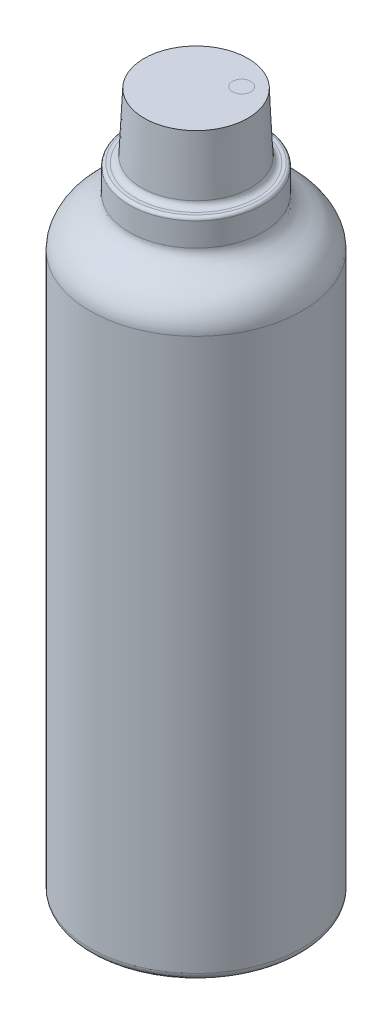
ISO-10303-21;
HEADER;
FILE_DESCRIPTION(('STEP AP214'),'2;1');
FILE_NAME('part.step','',(''),(''),'','','');
FILE_SCHEMA(('AUTOMOTIVE_DESIGN { 1 0 10303 214 1 1 1 1 }'));
ENDSEC;
DATA;
#1=APPLICATION_CONTEXT('core data for automotive mechanical design processes');
#2=APPLICATION_PROTOCOL_DEFINITION('international standard','automotive_design',2000,#1);
#3=PRODUCT_CONTEXT('',#1,'mechanical');
#4=PRODUCT('Part','Part','',(#3));
#5=PRODUCT_RELATED_PRODUCT_CATEGORY('part','',(#4));
#6=PRODUCT_DEFINITION_FORMATION('','',#4);
#7=PRODUCT_DEFINITION_CONTEXT('part definition',#1,'design');
#8=PRODUCT_DEFINITION('design','',#6,#7);
#9=PRODUCT_DEFINITION_SHAPE('','',#8);
#10=(LENGTH_UNIT() NAMED_UNIT(*) SI_UNIT(.MILLI.,.METRE.));
#11=(NAMED_UNIT(*) PLANE_ANGLE_UNIT() SI_UNIT($,.RADIAN.));
#12=(NAMED_UNIT(*) SI_UNIT($,.STERADIAN.) SOLID_ANGLE_UNIT());
#13=UNCERTAINTY_MEASURE_WITH_UNIT(LENGTH_MEASURE(1.E-05),#10,'distance_accuracy_value','');
#14=(GEOMETRIC_REPRESENTATION_CONTEXT(3) GLOBAL_UNCERTAINTY_ASSIGNED_CONTEXT((#13)) GLOBAL_UNIT_ASSIGNED_CONTEXT((#10,
#11,#12)) REPRESENTATION_CONTEXT('',''));
#15=CARTESIAN_POINT('',(0.,0.,0.));
#16=DIRECTION('',(0.,0.,1.));
#17=DIRECTION('',(1.,0.,0.));
#18=AXIS2_PLACEMENT_3D('',#15,#16,#17);
#19=CARTESIAN_POINT('',(0.,230.,0.));
#20=DIRECTION('',(0.,1.,0.));
#21=DIRECTION('',(0.,0.,1.));
#22=AXIS2_PLACEMENT_3D('',#19,#20,#21);
#23=PLANE('',#22);
#24=CARTESIAN_POINT('',(0.,230.,0.));
#25=DIRECTION('',(0.,-1.,0.));
#26=DIRECTION('',(0.,0.,-1.));
#27=AXIS2_PLACEMENT_3D('',#24,#25,#26);
#28=CIRCLE('',#27,17.06);
#29=CARTESIAN_POINT('',(0.,230.,-17.06));
#30=VERTEX_POINT('',#29);
#31=EDGE_CURVE('E78',#30,#30,#28,.T.);
#32=ORIENTED_EDGE('',*,*,#31,.F.);
#33=EDGE_LOOP('',(#32));
#34=FACE_BOUND('',#33,.T.);
#35=CARTESIAN_POINT('',(7.,230.,-8.));
#36=DIRECTION('',(0.,1.,0.));
#37=DIRECTION('',(0.,0.,1.));
#38=AXIS2_PLACEMENT_3D('',#35,#36,#37);
#39=CIRCLE('',#38,3.);
#40=CARTESIAN_POINT('',(7.,230.,-5.));
#41=VERTEX_POINT('',#40);
#42=EDGE_CURVE('E10',#41,#41,#39,.F.);
#43=ORIENTED_EDGE('',*,*,#42,.T.);
#44=EDGE_LOOP('',(#43));
#45=FACE_BOUND('',#44,.T.);
#46=ADVANCED_FACE('F37',(#34,#45),#23,.T.);
#47=CARTESIAN_POINT('',(0.,207.75,0.));
#48=DIRECTION('',(0.,-1.,0.));
#49=DIRECTION('',(0.,0.,-1.));
#50=AXIS2_PLACEMENT_3D('',#47,#48,#49);
#51=TOROIDAL_SURFACE('',#50,21.,1.);
#52=CARTESIAN_POINT('',(0.,208.75,0.));
#53=DIRECTION('',(0.,-1.,0.));
#54=DIRECTION('',(0.,0.,-1.));
#55=AXIS2_PLACEMENT_3D('',#52,#53,#54);
#56=CIRCLE('',#55,21.);
#57=CARTESIAN_POINT('',(0.,208.75,-21.));
#58=VERTEX_POINT('',#57);
#59=EDGE_CURVE('E87',#58,#58,#56,.T.);
#60=ORIENTED_EDGE('',*,*,#59,.T.);
#61=EDGE_LOOP('',(#60));
#62=FACE_BOUND('',#61,.T.);
#63=CARTESIAN_POINT('',(0.,207.75,0.));
#64=DIRECTION('',(0.,-1.,0.));
#65=DIRECTION('',(0.,0.,-1.));
#66=AXIS2_PLACEMENT_3D('',#63,#64,#65);
#67=CIRCLE('',#66,22.);
#68=CARTESIAN_POINT('',(0.,207.75,-22.));
#69=VERTEX_POINT('',#68);
#70=EDGE_CURVE('E45',#69,#69,#67,.T.);
#71=ORIENTED_EDGE('',*,*,#70,.F.);
#72=EDGE_LOOP('',(#71));
#73=FACE_BOUND('',#72,.T.);
#74=ADVANCED_FACE('F39',(#62,#73),#51,.T.);
#75=CARTESIAN_POINT('',(0.,0.,0.));
#76=DIRECTION('',(0.,-1.,0.));
#77=DIRECTION('',(0.,0.,-1.));
#78=AXIS2_PLACEMENT_3D('',#75,#76,#77);
#79=CYLINDRICAL_SURFACE('',#78,22.);
#80=ORIENTED_EDGE('',*,*,#70,.T.);
#81=EDGE_LOOP('',(#80));
#82=FACE_BOUND('',#81,.T.);
#83=CARTESIAN_POINT('',(0.,200.,0.));
#84=DIRECTION('',(0.,-1.,0.));
#85=DIRECTION('',(0.,0.,-1.));
#86=AXIS2_PLACEMENT_3D('',#83,#84,#85);
#87=CIRCLE('',#86,22.);
#88=CARTESIAN_POINT('',(0.,200.,-22.));
#89=VERTEX_POINT('',#88);
#90=EDGE_CURVE('E51',#89,#89,#87,.T.);
#91=ORIENTED_EDGE('',*,*,#90,.F.);
#92=EDGE_LOOP('',(#91));
#93=FACE_BOUND('',#92,.T.);
#94=ADVANCED_FACE('F101',(#82,#93),#79,.T.);
#95=CARTESIAN_POINT('',(34.9,184.,0.));
#96=CARTESIAN_POINT('',(34.9,186.989827139463,0.));
#97=CARTESIAN_POINT('',(31.9156301226645,192.216128506132,0.));
#98=CARTESIAN_POINT('',(25.8249064696677,195.02723074203,0.));
#99=CARTESIAN_POINT('',(22.,197.912231805774,0.));
#100=CARTESIAN_POINT('',(22.,200.,0.));
#101=B_SPLINE_CURVE_WITH_KNOTS('',3,(#95,#96,#97,#98,#99,#100),.UNSPECIFIED.,.F.,.F.,(4,1,1,4),
(0.,0.42378280186537,0.726128109276307,1.),.UNSPECIFIED.);
#102=CARTESIAN_POINT('',(0.,0.,0.));
#103=DIRECTION('',(0.,-1.,0.));
#104=AXIS1_PLACEMENT('',#102,#103);
#105=SURFACE_OF_REVOLUTION('',#101,#104);
#106=ORIENTED_EDGE('',*,*,#90,.T.);
#107=EDGE_LOOP('',(#106));
#108=FACE_BOUND('',#107,.T.);
#109=CARTESIAN_POINT('',(0.,184.,0.));
#110=DIRECTION('',(0.,-1.,0.));
#111=DIRECTION('',(0.,0.,-1.));
#112=AXIS2_PLACEMENT_3D('',#109,#110,#111);
#113=CIRCLE('',#112,34.9);
#114=CARTESIAN_POINT('',(0.,184.,-34.9));
#115=VERTEX_POINT('',#114);
#116=EDGE_CURVE('E55',#115,#115,#113,.T.);
#117=ORIENTED_EDGE('',*,*,#116,.F.);
#118=EDGE_LOOP('',(#117));
#119=FACE_BOUND('',#118,.T.);
#120=ADVANCED_FACE('F97',(#108,#119),#105,.F.);
#121=CARTESIAN_POINT('',(0.,0.,0.));
#122=DIRECTION('',(0.,-1.,0.));
#123=DIRECTION('',(0.,0.,-1.));
#124=AXIS2_PLACEMENT_3D('',#121,#122,#123);
#125=CYLINDRICAL_SURFACE('',#124,34.9);
#126=ORIENTED_EDGE('',*,*,#116,.T.);
#127=EDGE_LOOP('',(#126));
#128=FACE_BOUND('',#127,.T.);
#129=CARTESIAN_POINT('',(0.,2.5,0.));
#130=DIRECTION('',(0.,-1.,0.));
#131=DIRECTION('',(0.,0.,-1.));
#132=AXIS2_PLACEMENT_3D('',#129,#130,#131);
#133=CIRCLE('',#132,34.9);
#134=CARTESIAN_POINT('',(0.,2.5,-34.9));
#135=VERTEX_POINT('',#134);
#136=EDGE_CURVE('E60',#135,#135,#133,.T.);
#137=ORIENTED_EDGE('',*,*,#136,.F.);
#138=EDGE_LOOP('',(#137));
#139=FACE_BOUND('',#138,.T.);
#140=ADVANCED_FACE('F100',(#128,#139),#125,.T.);
#141=CARTESIAN_POINT('',(0.,2.5,0.));
#142=DIRECTION('',(0.,-1.,0.));
#143=DIRECTION('',(0.,0.,-1.));
#144=AXIS2_PLACEMENT_3D('',#141,#142,#143);
#145=TOROIDAL_SURFACE('',#144,32.4,2.5);
#146=ORIENTED_EDGE('',*,*,#136,.T.);
#147=EDGE_LOOP('',(#146));
#148=FACE_BOUND('',#147,.T.);
#149=CARTESIAN_POINT('',(0.,0.,0.));
#150=DIRECTION('',(0.,-1.,0.));
#151=DIRECTION('',(0.,0.,-1.));
#152=AXIS2_PLACEMENT_3D('',#149,#150,#151);
#153=CIRCLE('',#152,32.4);
#154=CARTESIAN_POINT('',(0.,0.,-32.4));
#155=VERTEX_POINT('',#154);
#156=EDGE_CURVE('E63',#155,#155,#153,.T.);
#157=ORIENTED_EDGE('',*,*,#156,.F.);
#158=EDGE_LOOP('',(#157));
#159=FACE_BOUND('',#158,.T.);
#160=ADVANCED_FACE('F143',(#148,#159),#145,.T.);
#161=CARTESIAN_POINT('',(28.17645836158,0.,0.));
#162=DIRECTION('',(0.,-1.,0.));
#163=DIRECTION('',(0.,0.,-1.));
#164=AXIS2_PLACEMENT_3D('',#161,#162,#163);
#165=PLANE('',#164);
#166=ORIENTED_EDGE('',*,*,#156,.T.);
#167=EDGE_LOOP('',(#166));
#168=FACE_BOUND('',#167,.T.);
#169=CARTESIAN_POINT('',(0.,0.,0.));
#170=DIRECTION('',(0.,-1.,0.));
#171=DIRECTION('',(0.,0.,-1.));
#172=AXIS2_PLACEMENT_3D('',#169,#170,#171);
#173=CIRCLE('',#172,28.17645836158);
#174=CARTESIAN_POINT('',(0.,0.,-28.17645836158));
#175=VERTEX_POINT('',#174);
#176=EDGE_CURVE('E66',#175,#175,#173,.T.);
#177=ORIENTED_EDGE('',*,*,#176,.F.);
#178=EDGE_LOOP('',(#177));
#179=FACE_BOUND('',#178,.T.);
#180=ADVANCED_FACE('F140',(#168,#179),#165,.T.);
#181=CARTESIAN_POINT('',(0.,3.,0.));
#182=DIRECTION('',(0.,-1.,0.));
#183=DIRECTION('',(0.,0.,-1.));
#184=AXIS2_PLACEMENT_3D('',#181,#182,#183);
#185=TOROIDAL_SURFACE('',#184,28.17645836158,3.);
#186=ORIENTED_EDGE('',*,*,#176,.T.);
#187=EDGE_LOOP('',(#186));
#188=FACE_BOUND('',#187,.T.);
#189=CARTESIAN_POINT('',(0.,0.180922137642276,0.));
#190=DIRECTION('',(0.,-1.,0.));
#191=DIRECTION('',(0.,0.,-1.));
#192=AXIS2_PLACEMENT_3D('',#189,#190,#191);
#193=CIRCLE('',#192,27.150397931603);
#194=CARTESIAN_POINT('',(0.,0.180922137642276,-27.150397931603));
#195=VERTEX_POINT('',#194);
#196=EDGE_CURVE('E69',#195,#195,#193,.T.);
#197=ORIENTED_EDGE('',*,*,#196,.F.);
#198=EDGE_LOOP('',(#197));
#199=FACE_BOUND('',#198,.T.);
#200=ADVANCED_FACE('F136',(#188,#199),#185,.T.);
#201=CARTESIAN_POINT('',(0.,0.819077862357724,0.));
#202=DIRECTION('',(0.,-1.,0.));
#203=DIRECTION('',(0.,0.,-1.));
#204=AXIS2_PLACEMENT_3D('',#201,#202,#203);
#205=CONICAL_SURFACE('',#204,25.3970794878516,1.22173047639603);
#206=ORIENTED_EDGE('',*,*,#196,.T.);
#207=EDGE_LOOP('',(#206));
#208=FACE_BOUND('',#207,.T.);
#209=CARTESIAN_POINT('',(0.,0.819077862357724,0.));
#210=DIRECTION('',(0.,-1.,0.));
#211=DIRECTION('',(0.,0.,-1.));
#212=AXIS2_PLACEMENT_3D('',#209,#210,#211);
#213=CIRCLE('',#212,25.3970794878516);
#214=CARTESIAN_POINT('',(0.,0.819077862357724,-25.3970794878516));
#215=VERTEX_POINT('',#214);
#216=EDGE_CURVE('E72',#215,#215,#213,.T.);
#217=ORIENTED_EDGE('',*,*,#216,.F.);
#218=EDGE_LOOP('',(#217));
#219=FACE_BOUND('',#218,.T.);
#220=ADVANCED_FACE('F130',(#208,#219),#205,.F.);
#221=CARTESIAN_POINT('',(0.,-2.,0.));
#222=DIRECTION('',(0.,-1.,0.));
#223=DIRECTION('',(0.,0.,-1.));
#224=AXIS2_PLACEMENT_3D('',#221,#222,#223);
#225=TOROIDAL_SURFACE('',#224,24.3710190578746,3.);
#226=ORIENTED_EDGE('',*,*,#216,.T.);
#227=EDGE_LOOP('',(#226));
#228=FACE_BOUND('',#227,.T.);
#229=CARTESIAN_POINT('',(0.,1.,0.));
#230=DIRECTION('',(0.,-1.,0.));
#231=DIRECTION('',(0.,0.,-1.));
#232=AXIS2_PLACEMENT_3D('',#229,#230,#231);
#233=CIRCLE('',#232,24.3710190578746);
#234=CARTESIAN_POINT('',(0.,1.,-24.3710190578746));
#235=VERTEX_POINT('',#234);
#236=EDGE_CURVE('E75',#235,#235,#233,.T.);
#237=ORIENTED_EDGE('',*,*,#236,.F.);
#238=EDGE_LOOP('',(#237));
#239=FACE_BOUND('',#238,.T.);
#240=ADVANCED_FACE('F126',(#228,#239),#225,.F.);
#241=CARTESIAN_POINT('',(0.,1.,0.));
#242=DIRECTION('',(0.,-1.,0.));
#243=DIRECTION('',(0.,0.,-1.));
#244=AXIS2_PLACEMENT_3D('',#241,#242,#243);
#245=PLANE('',#244);
#246=ORIENTED_EDGE('',*,*,#236,.T.);
#247=EDGE_LOOP('',(#246));
#248=FACE_BOUND('',#247,.T.);
#249=ADVANCED_FACE('F119',(#248),#245,.T.);
#250=ORIENTED_EDGE('',*,*,#42,.F.);
#251=EDGE_LOOP('',(#250));
#252=FACE_BOUND('',#251,.T.);
#253=ADVANCED_FACE('F112',(#252),#23,.T.);
#254=CARTESIAN_POINT('',(0.,210.655986393484,0.));
#255=DIRECTION('',(0.,-1.,0.));
#256=DIRECTION('',(0.,0.,-1.));
#257=AXIS2_PLACEMENT_3D('',#254,#255,#256);
#258=CONICAL_SURFACE('',#257,17.9703065226596,0.0470241318427463);
#259=ORIENTED_EDGE('',*,*,#31,.T.);
#260=EDGE_LOOP('',(#259));
#261=FACE_BOUND('',#260,.T.);
#262=CARTESIAN_POINT('',(0.,210.655986393484,0.));
#263=DIRECTION('',(0.,-1.,0.));
#264=DIRECTION('',(0.,0.,-1.));
#265=AXIS2_PLACEMENT_3D('',#262,#263,#264);
#266=CIRCLE('',#265,17.9703065226596);
#267=CARTESIAN_POINT('',(0.,210.655986393484,-17.9703065226596));
#268=VERTEX_POINT('',#267);
#269=EDGE_CURVE('E81',#268,#268,#266,.T.);
#270=ORIENTED_EDGE('',*,*,#269,.F.);
#271=EDGE_LOOP('',(#270));
#272=FACE_BOUND('',#271,.T.);
#273=ADVANCED_FACE('F118',(#261,#272),#258,.T.);
#274=CARTESIAN_POINT('',(0.,210.75,0.));
#275=DIRECTION('',(0.,-1.,0.));
#276=DIRECTION('',(0.,0.,-1.));
#277=AXIS2_PLACEMENT_3D('',#274,#275,#276);
#278=TOROIDAL_SURFACE('',#277,19.9680956611299,2.);
#279=ORIENTED_EDGE('',*,*,#269,.T.);
#280=EDGE_LOOP('',(#279));
#281=FACE_BOUND('',#280,.T.);
#282=CARTESIAN_POINT('',(0.,208.75,0.));
#283=DIRECTION('',(0.,-1.,0.));
#284=DIRECTION('',(0.,0.,-1.));
#285=AXIS2_PLACEMENT_3D('',#282,#283,#284);
#286=CIRCLE('',#285,19.9680956611299);
#287=CARTESIAN_POINT('',(0.,208.75,-19.9680956611299));
#288=VERTEX_POINT('',#287);
#289=EDGE_CURVE('E84',#288,#288,#286,.T.);
#290=ORIENTED_EDGE('',*,*,#289,.F.);
#291=EDGE_LOOP('',(#290));
#292=FACE_BOUND('',#291,.T.);
#293=ADVANCED_FACE('F124',(#281,#292),#278,.F.);
#294=CARTESIAN_POINT('',(19.9680956611299,208.75,0.));
#295=DIRECTION('',(0.,1.,0.));
#296=DIRECTION('',(0.,0.,1.));
#297=AXIS2_PLACEMENT_3D('',#294,#295,#296);
#298=PLANE('',#297);
#299=ORIENTED_EDGE('',*,*,#289,.T.);
#300=EDGE_LOOP('',(#299));
#301=FACE_BOUND('',#300,.T.);
#302=ORIENTED_EDGE('',*,*,#59,.F.);
#303=EDGE_LOOP('',(#302));
#304=FACE_BOUND('',#303,.T.);
#305=ADVANCED_FACE('F237',(#301,#304),#298,.T.);
#306=CLOSED_SHELL('',(#46,#74,#94,#120,#140,#160,#180,#200,#220,#240,#249,#253,#273,#293,#305));
#307=MANIFOLD_SOLID_BREP('B2',#306);
#308=ADVANCED_BREP_SHAPE_REPRESENTATION('',(#18,#307),#14);
#309=SHAPE_DEFINITION_REPRESENTATION(#9,#308);
ENDSEC;
END-ISO-10303-21;
